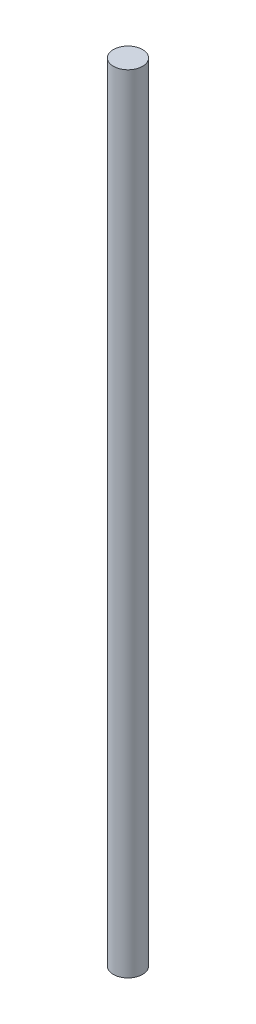
ISO-10303-21;
HEADER;
FILE_DESCRIPTION(('STEP AP214'),'2;1');
FILE_NAME('part.step','',(''),(''),'','','');
FILE_SCHEMA(('AUTOMOTIVE_DESIGN { 1 0 10303 214 1 1 1 1 }'));
ENDSEC;
DATA;
#1=APPLICATION_CONTEXT('core data for automotive mechanical design processes');
#2=APPLICATION_PROTOCOL_DEFINITION('international standard','automotive_design',2000,#1);
#3=PRODUCT_CONTEXT('',#1,'mechanical');
#4=PRODUCT('Part','Part','',(#3));
#5=PRODUCT_RELATED_PRODUCT_CATEGORY('part','',(#4));
#6=PRODUCT_DEFINITION_FORMATION('','',#4);
#7=PRODUCT_DEFINITION_CONTEXT('part definition',#1,'design');
#8=PRODUCT_DEFINITION('design','',#6,#7);
#9=PRODUCT_DEFINITION_SHAPE('','',#8);
#10=(LENGTH_UNIT() NAMED_UNIT(*) SI_UNIT(.MILLI.,.METRE.));
#11=(NAMED_UNIT(*) PLANE_ANGLE_UNIT() SI_UNIT($,.RADIAN.));
#12=(NAMED_UNIT(*) SI_UNIT($,.STERADIAN.) SOLID_ANGLE_UNIT());
#13=UNCERTAINTY_MEASURE_WITH_UNIT(LENGTH_MEASURE(1.E-05),#10,'distance_accuracy_value','');
#14=(GEOMETRIC_REPRESENTATION_CONTEXT(3) GLOBAL_UNCERTAINTY_ASSIGNED_CONTEXT((#13)) GLOBAL_UNIT_ASSIGNED_CONTEXT((#10,
#11,#12)) REPRESENTATION_CONTEXT('',''));
#15=CARTESIAN_POINT('',(0.,0.,0.));
#16=DIRECTION('',(0.,0.,1.));
#17=DIRECTION('',(1.,0.,0.));
#18=AXIS2_PLACEMENT_3D('',#15,#16,#17);
#19=CARTESIAN_POINT('',(0.,27.,0.));
#20=DIRECTION('',(0.,-1.,0.));
#21=DIRECTION('',(0.,0.,-1.));
#22=AXIS2_PLACEMENT_3D('',#19,#20,#21);
#23=CYLINDRICAL_SURFACE('',#22,0.5);
#24=CARTESIAN_POINT('',(0.,27.,0.));
#25=DIRECTION('',(0.,1.,0.));
#26=DIRECTION('',(0.,0.,1.));
#27=AXIS2_PLACEMENT_3D('',#24,#25,#26);
#28=CIRCLE('',#27,0.5);
#29=CARTESIAN_POINT('',(0.,27.,0.5));
#30=VERTEX_POINT('',#29);
#31=EDGE_CURVE('E10',#30,#30,#28,.T.);
#32=ORIENTED_EDGE('',*,*,#31,.F.);
#33=EDGE_LOOP('',(#32));
#34=FACE_BOUND('',#33,.T.);
#35=CARTESIAN_POINT('',(0.,0.,0.));
#36=DIRECTION('',(0.,1.,0.));
#37=DIRECTION('',(0.,0.,1.));
#38=AXIS2_PLACEMENT_3D('',#35,#36,#37);
#39=CIRCLE('',#38,0.5);
#40=CARTESIAN_POINT('',(0.,0.,0.5));
#41=VERTEX_POINT('',#40);
#42=EDGE_CURVE('E40',#41,#41,#39,.T.);
#43=ORIENTED_EDGE('',*,*,#42,.T.);
#44=EDGE_LOOP('',(#43));
#45=FACE_BOUND('',#44,.T.);
#46=ADVANCED_FACE('F37',(#34,#45),#23,.T.);
#47=CARTESIAN_POINT('',(0.,27.,0.));
#48=DIRECTION('',(0.,1.,0.));
#49=DIRECTION('',(0.,0.,1.));
#50=AXIS2_PLACEMENT_3D('',#47,#48,#49);
#51=PLANE('',#50);
#52=ORIENTED_EDGE('',*,*,#31,.T.);
#53=EDGE_LOOP('',(#52));
#54=FACE_BOUND('',#53,.T.);
#55=ADVANCED_FACE('F54',(#54),#51,.T.);
#56=CARTESIAN_POINT('',(0.,0.,0.));
#57=DIRECTION('',(0.,1.,0.));
#58=DIRECTION('',(0.,0.,1.));
#59=AXIS2_PLACEMENT_3D('',#56,#57,#58);
#60=PLANE('',#59);
#61=ORIENTED_EDGE('',*,*,#42,.F.);
#62=EDGE_LOOP('',(#61));
#63=FACE_BOUND('',#62,.T.);
#64=ADVANCED_FACE('F52',(#63),#60,.F.);
#65=CLOSED_SHELL('',(#46,#55,#64));
#66=MANIFOLD_SOLID_BREP('B2',#65);
#67=ADVANCED_BREP_SHAPE_REPRESENTATION('',(#18,#66),#14);
#68=SHAPE_DEFINITION_REPRESENTATION(#9,#67);
ENDSEC;
END-ISO-10303-21;
